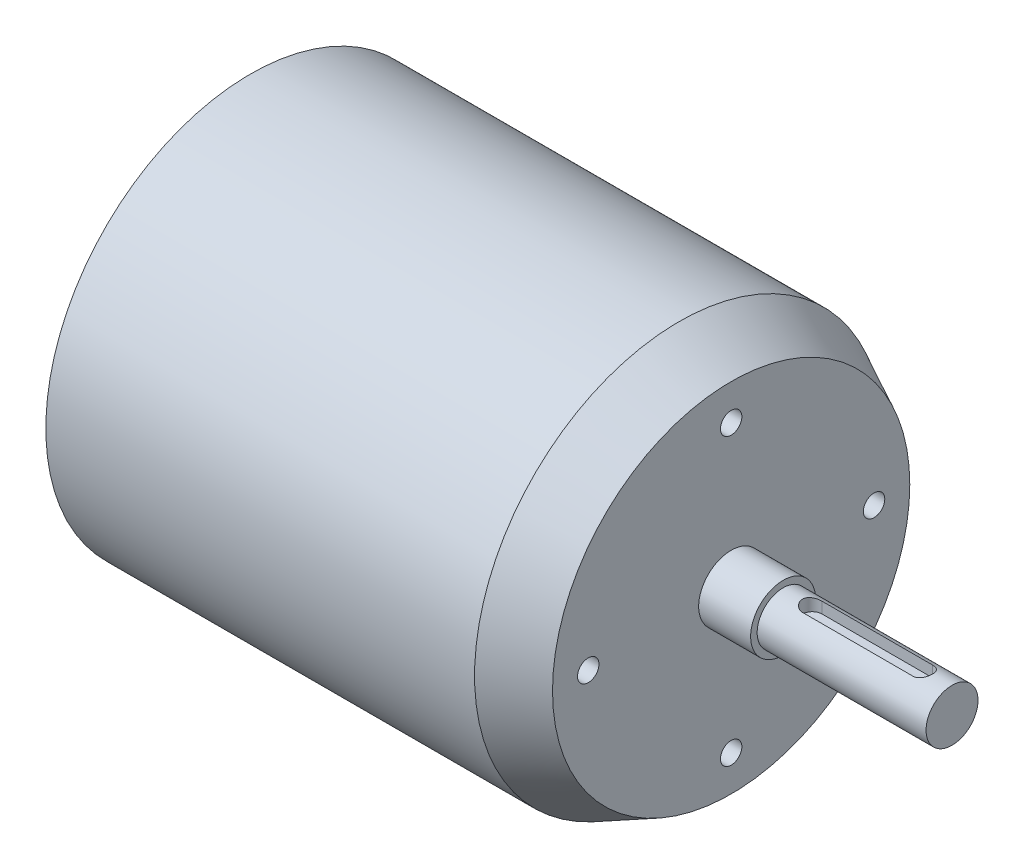
ISO-10303-21;
HEADER;
FILE_DESCRIPTION(('STEP AP214'),'2;1');
FILE_NAME('part.step','',(''),(''),'','','');
FILE_SCHEMA(('AUTOMOTIVE_DESIGN { 1 0 10303 214 1 1 1 1 }'));
ENDSEC;
DATA;
#1=APPLICATION_CONTEXT('core data for automotive mechanical design processes');
#2=APPLICATION_PROTOCOL_DEFINITION('international standard','automotive_design',2000,#1);
#3=PRODUCT_CONTEXT('',#1,'mechanical');
#4=PRODUCT('Part','Part','',(#3));
#5=PRODUCT_RELATED_PRODUCT_CATEGORY('part','',(#4));
#6=PRODUCT_DEFINITION_FORMATION('','',#4);
#7=PRODUCT_DEFINITION_CONTEXT('part definition',#1,'design');
#8=PRODUCT_DEFINITION('design','',#6,#7);
#9=PRODUCT_DEFINITION_SHAPE('','',#8);
#10=(LENGTH_UNIT() NAMED_UNIT(*) SI_UNIT(.MILLI.,.METRE.));
#11=(NAMED_UNIT(*) PLANE_ANGLE_UNIT() SI_UNIT($,.RADIAN.));
#12=(NAMED_UNIT(*) SI_UNIT($,.STERADIAN.) SOLID_ANGLE_UNIT());
#13=UNCERTAINTY_MEASURE_WITH_UNIT(LENGTH_MEASURE(1.E-05),#10,'distance_accuracy_value','');
#14=(GEOMETRIC_REPRESENTATION_CONTEXT(3) GLOBAL_UNCERTAINTY_ASSIGNED_CONTEXT((#13)) GLOBAL_UNIT_ASSIGNED_CONTEXT((#10,
#11,#12)) REPRESENTATION_CONTEXT('',''));
#15=CARTESIAN_POINT('',(0.,0.,0.));
#16=DIRECTION('',(0.,0.,1.));
#17=DIRECTION('',(1.,0.,0.));
#18=AXIS2_PLACEMENT_3D('',#15,#16,#17);
#19=CARTESIAN_POINT('',(0.,0.,0.));
#20=DIRECTION('',(1.,0.,0.));
#21=DIRECTION('',(0.,0.,-1.));
#22=AXIS2_PLACEMENT_3D('',#19,#20,#21);
#23=PLANE('',#22);
#24=CARTESIAN_POINT('',(0.,0.,0.));
#25=DIRECTION('',(1.,0.,0.));
#26=DIRECTION('',(0.,0.,-1.));
#27=AXIS2_PLACEMENT_3D('',#24,#25,#26);
#28=CIRCLE('',#27,5.);
#29=CARTESIAN_POINT('',(0.,0.,-5.));
#30=VERTEX_POINT('',#29);
#31=EDGE_CURVE('E243',#30,#30,#28,.T.);
#32=ORIENTED_EDGE('',*,*,#31,.F.);
#33=EDGE_LOOP('',(#32));
#34=FACE_BOUND('',#33,.T.);
#35=CARTESIAN_POINT('',(0.,0.,22.));
#36=DIRECTION('',(1.,0.,0.));
#37=DIRECTION('',(0.,0.,-1.));
#38=AXIS2_PLACEMENT_3D('',#35,#36,#37);
#39=CIRCLE('',#38,1.65);
#40=CARTESIAN_POINT('',(0.,0.,20.35));
#41=VERTEX_POINT('',#40);
#42=EDGE_CURVE('E153',#41,#41,#39,.T.);
#43=ORIENTED_EDGE('',*,*,#42,.F.);
#44=EDGE_LOOP('',(#43));
#45=FACE_BOUND('',#44,.T.);
#46=CARTESIAN_POINT('',(0.,-22.,0.));
#47=DIRECTION('',(1.,0.,0.));
#48=DIRECTION('',(0.,0.,-1.));
#49=AXIS2_PLACEMENT_3D('',#46,#47,#48);
#50=CIRCLE('',#49,1.65);
#51=CARTESIAN_POINT('',(0.,-22.,-1.65));
#52=VERTEX_POINT('',#51);
#53=EDGE_CURVE('E147',#52,#52,#50,.T.);
#54=ORIENTED_EDGE('',*,*,#53,.F.);
#55=EDGE_LOOP('',(#54));
#56=FACE_BOUND('',#55,.T.);
#57=CARTESIAN_POINT('',(0.,0.,-22.));
#58=DIRECTION('',(1.,0.,0.));
#59=DIRECTION('',(0.,0.,-1.));
#60=AXIS2_PLACEMENT_3D('',#57,#58,#59);
#61=CIRCLE('',#60,1.65);
#62=CARTESIAN_POINT('',(0.,0.,-23.65));
#63=VERTEX_POINT('',#62);
#64=EDGE_CURVE('E134',#63,#63,#61,.T.);
#65=ORIENTED_EDGE('',*,*,#64,.F.);
#66=EDGE_LOOP('',(#65));
#67=FACE_BOUND('',#66,.T.);
#68=CARTESIAN_POINT('',(0.,22.,0.));
#69=DIRECTION('',(1.,0.,0.));
#70=DIRECTION('',(0.,0.,-1.));
#71=AXIS2_PLACEMENT_3D('',#68,#69,#70);
#72=CIRCLE('',#71,1.65);
#73=CARTESIAN_POINT('',(0.,22.,-1.65));
#74=VERTEX_POINT('',#73);
#75=EDGE_CURVE('E135',#74,#74,#72,.T.);
#76=ORIENTED_EDGE('',*,*,#75,.F.);
#77=EDGE_LOOP('',(#76));
#78=FACE_BOUND('',#77,.T.);
#79=CARTESIAN_POINT('',(0.,0.,0.));
#80=DIRECTION('',(1.,0.,0.));
#81=DIRECTION('',(0.,0.,-1.));
#82=AXIS2_PLACEMENT_3D('',#79,#80,#81);
#83=CIRCLE('',#82,27.5);
#84=CARTESIAN_POINT('',(0.,0.,-27.5));
#85=VERTEX_POINT('',#84);
#86=EDGE_CURVE('E282',#85,#85,#83,.T.);
#87=ORIENTED_EDGE('',*,*,#86,.T.);
#88=EDGE_LOOP('',(#87));
#89=FACE_BOUND('',#88,.T.);
#90=ADVANCED_FACE('F73',(#34,#45,#56,#67,#78,#89),#23,.T.);
#91=CARTESIAN_POINT('',(34.,0.,0.));
#92=DIRECTION('',(-1.,0.,0.));
#93=DIRECTION('',(0.,0.,1.));
#94=AXIS2_PLACEMENT_3D('',#91,#92,#93);
#95=CYLINDRICAL_SURFACE('',#94,4.);
#96=CARTESIAN_POINT('',(34.,0.,0.));
#97=DIRECTION('',(1.,0.,0.));
#98=DIRECTION('',(0.,0.,-1.));
#99=AXIS2_PLACEMENT_3D('',#96,#97,#98);
#100=CIRCLE('',#99,4.);
#101=CARTESIAN_POINT('',(34.,0.,-4.));
#102=VERTEX_POINT('',#101);
#103=EDGE_CURVE('E204',#102,#102,#100,.T.);
#104=ORIENTED_EDGE('',*,*,#103,.F.);
#105=EDGE_LOOP('',(#104));
#106=FACE_BOUND('',#105,.T.);
#107=CARTESIAN_POINT('',(8.,0.,0.));
#108=DIRECTION('',(1.,0.,0.));
#109=DIRECTION('',(0.,0.,-1.));
#110=AXIS2_PLACEMENT_3D('',#107,#108,#109);
#111=CIRCLE('',#110,4.);
#112=CARTESIAN_POINT('',(8.,0.,-4.));
#113=VERTEX_POINT('',#112);
#114=EDGE_CURVE('E239',#113,#113,#111,.T.);
#115=ORIENTED_EDGE('',*,*,#114,.T.);
#116=EDGE_LOOP('',(#115));
#117=FACE_BOUND('',#116,.T.);
#118=DIRECTION('',(-1.,0.,0.));
#119=VECTOR('',#118,1.);
#120=CARTESIAN_POINT('',(34.,3.70809924354783,-1.5));
#121=LINE('',#120,#119);
#122=CARTESIAN_POINT('',(29.5,3.70809924354783,-1.5));
#123=VERTEX_POINT('',#122);
#124=CARTESIAN_POINT('',(12.5,3.70809924354783,-1.5));
#125=VERTEX_POINT('',#124);
#126=EDGE_CURVE('E12',#123,#125,#121,.T.);
#127=ORIENTED_EDGE('',*,*,#126,.F.);
#128=CARTESIAN_POINT('',(29.5,3.70809924354783,1.5));
#129=CARTESIAN_POINT('',(29.5405925330296,3.70809443619348,1.50000149729857));
#130=CARTESIAN_POINT('',(29.5811639292878,3.70876663375751,1.49835118206537));
#131=CARTESIAN_POINT('',(29.6619845387273,3.71141673218275,1.49177905295192));
#132=CARTESIAN_POINT('',(29.7022338554932,3.7133941946446,1.48685833749724));
#133=CARTESIAN_POINT('',(29.8217672157252,3.72118975606221,1.46729482367935));
#134=CARTESIAN_POINT('',(29.9001996602272,3.72887188404209,1.44784998767984));
#135=CARTESIAN_POINT('',(30.0523675185151,3.74825217997878,1.39690233043372));
#136=CARTESIAN_POINT('',(30.1261068290407,3.7599469632381,1.36540966903062));
#137=CARTESIAN_POINT('',(30.2673335200613,3.7860238820009,1.29134097725474));
#138=CARTESIAN_POINT('',(30.3348157220124,3.80040821426565,1.24875587557702));
#139=CARTESIAN_POINT('',(30.4648919199407,3.83103589828726,1.15146603872017));
#140=CARTESIAN_POINT('',(30.5271300143182,3.84733374054252,1.09630269892844));
#141=CARTESIAN_POINT('',(30.6417235930174,3.8794978206844,0.976394584974257));
#142=CARTESIAN_POINT('',(30.6940771643404,3.8953639745168,0.911647960429702));
#143=CARTESIAN_POINT('',(30.7891402142536,3.92552893891845,0.771693719740036));
#144=CARTESIAN_POINT('',(30.8314606006837,3.93975598379754,0.696204968758629));
#145=CARTESIAN_POINT('',(30.9026519110829,3.96438035322528,0.538553622304926));
#146=CARTESIAN_POINT('',(30.9315278494869,3.97477910532575,0.456393528521807));
#147=CARTESIAN_POINT('',(30.9737577188216,3.99018690464435,0.29149005067059));
#148=CARTESIAN_POINT('',(30.987727384304,3.99540906103972,0.208924649211911));
#149=CARTESIAN_POINT('',(31.001721197932,4.00064014015322,0.0424658385808881));
#150=CARTESIAN_POINT('',(31.0017496368019,4.00065066686691,-0.0414271540462108));
#151=CARTESIAN_POINT('',(30.988218193771,3.99559264174045,-0.203744100069408));
#152=CARTESIAN_POINT('',(30.9753305247926,3.99077535168083,-0.282233282883083));
#153=CARTESIAN_POINT('',(30.9374637288878,3.97693262269583,-0.435840275995114));
#154=CARTESIAN_POINT('',(30.9124839153537,3.96790694481372,-0.51095789458693));
#155=CARTESIAN_POINT('',(30.8508296074042,3.94637770601049,-0.656988917196577));
#156=CARTESIAN_POINT('',(30.8139901590766,3.93382542785069,-0.72782519801218));
#157=CARTESIAN_POINT('',(30.7298079624269,3.90651314175191,-0.862486444375066));
#158=CARTESIAN_POINT('',(30.6824617982127,3.89175241632298,-0.926309119580089));
#159=CARTESIAN_POINT('',(30.5753768685089,3.86052643048223,-1.04908600084313));
#160=CARTESIAN_POINT('',(30.515075615665,3.84401196825707,-1.10753779261244));
#161=CARTESIAN_POINT('',(30.3854158656222,3.81182684214318,-1.21369725159035));
#162=CARTESIAN_POINT('',(30.3160538253526,3.79615651174147,-1.26140069584828));
#163=CARTESIAN_POINT('',(30.1682419715862,3.7671186794103,-1.34567998313248));
#164=CARTESIAN_POINT('',(30.0896215943324,3.75381153298453,-1.38197861969246));
#165=CARTESIAN_POINT('',(29.9267936781581,3.73171449181344,-1.44059114536973));
#166=CARTESIAN_POINT('',(29.8425957950671,3.72291700934124,-1.46292853893353));
#167=CARTESIAN_POINT('',(29.7146189823522,3.7140622685257,-1.48519272209728));
#168=CARTESIAN_POINT('',(29.6718976704794,3.71183476402566,-1.49074028414002));
#169=CARTESIAN_POINT('',(29.5861259311283,3.70885093143242,-1.49814308997677));
#170=CARTESIAN_POINT('',(29.5430758469706,3.70809323601798,-1.50000176547338));
#171=CARTESIAN_POINT('',(29.5,3.70809924354783,-1.5));
#172=B_SPLINE_CURVE_WITH_KNOTS('',3,(#128,#129,#130,#131,#132,#133,#134,#135,#136,#137,#138,
#139,#140,#141,#142,#143,#144,#145,#146,#147,#148,#149,#150,#151,#152,#153,#154,#155,#156,#157,
#158,#159,#160,#161,#162,#163,#164,#165,#166,#167,#168,#169,#170,#171),.UNSPECIFIED.,.F.,.F.,(4,
2,2,2,2,2,2,2,2,2,2,2,2,2,2,2,2,2,2,2,2,4),(0.,0.121697465666185,0.243354077586413,
0.485593064591345,0.727628221922016,0.969861938431285,1.22298027419407,1.47614754705134,
1.73793539440997,1.9996255232324,2.25002925199203,2.50035591335681,2.73829765644058,
2.97625291175452,3.21767225141683,3.45917019544674,3.71477993951631,3.97048993642583,
4.23200510445915,4.49307880432491,4.62233004062784,4.75146098044214),.UNSPECIFIED.);
#173=CARTESIAN_POINT('',(29.5,3.70809924354783,1.5));
#174=VERTEX_POINT('',#173);
#175=EDGE_CURVE('E81',#174,#123,#172,.T.);
#176=ORIENTED_EDGE('',*,*,#175,.F.);
#177=DIRECTION('',(-1.,0.,0.));
#178=VECTOR('',#177,1.);
#179=CARTESIAN_POINT('',(34.,3.70809924354783,1.5));
#180=LINE('',#179,#178);
#181=CARTESIAN_POINT('',(12.5,3.70809924354783,1.5));
#182=VERTEX_POINT('',#181);
#183=EDGE_CURVE('E95',#182,#174,#180,.F.);
#184=ORIENTED_EDGE('',*,*,#183,.F.);
#185=CARTESIAN_POINT('',(12.5,3.70809924354783,-1.5));
#186=CARTESIAN_POINT('',(12.4594074669704,3.70809443619348,-1.50000149729856));
#187=CARTESIAN_POINT('',(12.4188360707122,3.70876663375751,-1.49835118206537));
#188=CARTESIAN_POINT('',(12.3380154612727,3.71141673218275,-1.49177905295192));
#189=CARTESIAN_POINT('',(12.2977661445068,3.7133941946446,-1.48685833749724));
#190=CARTESIAN_POINT('',(12.1782327842748,3.72118975606221,-1.46729482367934));
#191=CARTESIAN_POINT('',(12.0998003397728,3.7288718840421,-1.44784998767984));
#192=CARTESIAN_POINT('',(11.9476324814849,3.74825217997878,-1.39690233043372));
#193=CARTESIAN_POINT('',(11.8738931709593,3.75994696323811,-1.36540966903062));
#194=CARTESIAN_POINT('',(11.7326664799387,3.78602388200091,-1.29134097725473));
#195=CARTESIAN_POINT('',(11.6651842779876,3.80040821426565,-1.24875587557702));
#196=CARTESIAN_POINT('',(11.5351080800593,3.83103589828726,-1.15146603872016));
#197=CARTESIAN_POINT('',(11.4728699856818,3.84733374054252,-1.09630269892843));
#198=CARTESIAN_POINT('',(11.3582764069826,3.8794978206844,-0.976394584974255));
#199=CARTESIAN_POINT('',(11.3059228356596,3.8953639745168,-0.9116479604297));
#200=CARTESIAN_POINT('',(11.2108597857464,3.92552893891845,-0.771693719740035));
#201=CARTESIAN_POINT('',(11.1685393993163,3.93975598379754,-0.696204968758628));
#202=CARTESIAN_POINT('',(11.0973480889171,3.96438035322528,-0.538553622304924));
#203=CARTESIAN_POINT('',(11.0684721505131,3.97477910532575,-0.456393528521805));
#204=CARTESIAN_POINT('',(11.0262422811784,3.99018690464435,-0.291490050670587));
#205=CARTESIAN_POINT('',(11.012272615696,3.99540906103972,-0.208924649211909));
#206=CARTESIAN_POINT('',(10.998278802068,4.00064014015322,-0.042465838580887));
#207=CARTESIAN_POINT('',(10.9982503631981,4.00065066686691,0.0414271540462113));
#208=CARTESIAN_POINT('',(11.011781806229,3.99559264174045,0.203744100069408));
#209=CARTESIAN_POINT('',(11.0246694752074,3.99077535168083,0.282233282883083));
#210=CARTESIAN_POINT('',(11.0625362711122,3.97693262269583,0.435840275995115));
#211=CARTESIAN_POINT('',(11.0875160846463,3.96790694481372,0.51095789458693));
#212=CARTESIAN_POINT('',(11.1491703925958,3.94637770601049,0.656988917196577));
#213=CARTESIAN_POINT('',(11.1860098409234,3.93382542785069,0.727825198012179));
#214=CARTESIAN_POINT('',(11.2701920375731,3.90651314175191,0.862486444375065));
#215=CARTESIAN_POINT('',(11.3175382017873,3.89175241632298,0.926309119580088));
#216=CARTESIAN_POINT('',(11.4246231314911,3.86052643048223,1.04908600084313));
#217=CARTESIAN_POINT('',(11.484924384335,3.84401196825707,1.10753779261244));
#218=CARTESIAN_POINT('',(11.6145841343778,3.81182684214318,1.21369725159035));
#219=CARTESIAN_POINT('',(11.6839461746474,3.79615651174147,1.26140069584828));
#220=CARTESIAN_POINT('',(11.8317580284138,3.7671186794103,1.34567998313248));
#221=CARTESIAN_POINT('',(11.9103784056676,3.75381153298453,1.38197861969245));
#222=CARTESIAN_POINT('',(12.0732063218419,3.73171449181344,1.44059114536973));
#223=CARTESIAN_POINT('',(12.157404204933,3.72291700934124,1.46292853893353));
#224=CARTESIAN_POINT('',(12.2853810176478,3.7140622685257,1.48519272209728));
#225=CARTESIAN_POINT('',(12.3281023295206,3.71183476402566,1.49074028414002));
#226=CARTESIAN_POINT('',(12.4138740688717,3.70885093143242,1.49814308997677));
#227=CARTESIAN_POINT('',(12.4569241530294,3.70809323601798,1.50000176547338));
#228=CARTESIAN_POINT('',(12.5,3.70809924354783,1.5));
#229=B_SPLINE_CURVE_WITH_KNOTS('',3,(#185,#186,#187,#188,#189,#190,#191,#192,#193,#194,#195,
#196,#197,#198,#199,#200,#201,#202,#203,#204,#205,#206,#207,#208,#209,#210,#211,#212,#213,#214,
#215,#216,#217,#218,#219,#220,#221,#222,#223,#224,#225,#226,#227,#228),.UNSPECIFIED.,.F.,.F.,(4,
2,2,2,2,2,2,2,2,2,2,2,2,2,2,2,2,2,2,2,2,4),(0.,0.121697465666189,0.243354077586421,
0.485593064591345,0.727628221922012,0.969861938431283,1.22298027419406,1.47614754705134,
1.73793539440997,1.99962552323239,2.25002925199202,2.5003559133568,2.73829765644058,
2.97625291175452,3.21767225141682,3.45917019544674,3.7147799395163,3.97048993642582,
4.23200510445915,4.4930788043249,4.62233004062784,4.75146098044213),.UNSPECIFIED.);
#230=EDGE_CURVE('E208',#125,#182,#229,.T.);
#231=ORIENTED_EDGE('',*,*,#230,.F.);
#232=EDGE_LOOP('',(#127,#176,#184,#231));
#233=FACE_BOUND('',#232,.T.);
#234=ADVANCED_FACE('F212',(#106,#117,#233),#95,.T.);
#235=CARTESIAN_POINT('',(8.,0.,0.));
#236=DIRECTION('',(-1.,0.,0.));
#237=DIRECTION('',(0.,0.,1.));
#238=AXIS2_PLACEMENT_3D('',#235,#236,#237);
#239=CYLINDRICAL_SURFACE('',#238,5.);
#240=CARTESIAN_POINT('',(8.,0.,0.));
#241=DIRECTION('',(1.,0.,0.));
#242=DIRECTION('',(0.,0.,-1.));
#243=AXIS2_PLACEMENT_3D('',#240,#241,#242);
#244=CIRCLE('',#243,5.);
#245=CARTESIAN_POINT('',(8.,0.,-5.));
#246=VERTEX_POINT('',#245);
#247=EDGE_CURVE('E244',#246,#246,#244,.T.);
#248=ORIENTED_EDGE('',*,*,#247,.F.);
#249=EDGE_LOOP('',(#248));
#250=FACE_BOUND('',#249,.T.);
#251=ORIENTED_EDGE('',*,*,#31,.T.);
#252=EDGE_LOOP('',(#251));
#253=FACE_BOUND('',#252,.T.);
#254=ADVANCED_FACE('F257',(#250,#253),#239,.T.);
#255=CARTESIAN_POINT('',(8.,0.,0.));
#256=DIRECTION('',(1.,0.,0.));
#257=DIRECTION('',(0.,0.,-1.));
#258=AXIS2_PLACEMENT_3D('',#255,#256,#257);
#259=PLANE('',#258);
#260=ORIENTED_EDGE('',*,*,#114,.F.);
#261=EDGE_LOOP('',(#260));
#262=FACE_BOUND('',#261,.T.);
#263=ORIENTED_EDGE('',*,*,#247,.T.);
#264=EDGE_LOOP('',(#263));
#265=FACE_BOUND('',#264,.T.);
#266=ADVANCED_FACE('F260',(#262,#265),#259,.T.);
#267=CARTESIAN_POINT('',(34.,0.,0.));
#268=DIRECTION('',(1.,0.,0.));
#269=DIRECTION('',(0.,0.,-1.));
#270=AXIS2_PLACEMENT_3D('',#267,#268,#269);
#271=PLANE('',#270);
#272=ORIENTED_EDGE('',*,*,#103,.T.);
#273=EDGE_LOOP('',(#272));
#274=FACE_BOUND('',#273,.T.);
#275=ADVANCED_FACE('F253',(#274),#271,.T.);
#276=CARTESIAN_POINT('',(12.5,4.,-1.5));
#277=DIRECTION('',(0.,0.,1.));
#278=DIRECTION('',(1.,0.,0.));
#279=AXIS2_PLACEMENT_3D('',#276,#277,#278);
#280=PLANE('',#279);
#281=ORIENTED_EDGE('',*,*,#126,.T.);
#282=DIRECTION('',(0.,-1.,0.));
#283=VECTOR('',#282,1.);
#284=CARTESIAN_POINT('',(12.5,4.,-1.5));
#285=LINE('',#284,#283);
#286=CARTESIAN_POINT('',(12.5,2.,-1.5));
#287=VERTEX_POINT('',#286);
#288=EDGE_CURVE('E165',#125,#287,#285,.T.);
#289=ORIENTED_EDGE('',*,*,#288,.T.);
#290=DIRECTION('',(-1.,0.,0.));
#291=VECTOR('',#290,1.);
#292=CARTESIAN_POINT('',(12.5,2.,-1.5));
#293=LINE('',#292,#291);
#294=CARTESIAN_POINT('',(29.5,2.,-1.5));
#295=VERTEX_POINT('',#294);
#296=EDGE_CURVE('E159',#295,#287,#293,.T.);
#297=ORIENTED_EDGE('',*,*,#296,.F.);
#298=DIRECTION('',(0.,-1.,0.));
#299=VECTOR('',#298,1.);
#300=CARTESIAN_POINT('',(29.5,4.,-1.5));
#301=LINE('',#300,#299);
#302=EDGE_CURVE('E169',#123,#295,#301,.T.);
#303=ORIENTED_EDGE('',*,*,#302,.F.);
#304=EDGE_LOOP('',(#281,#289,#297,#303));
#305=FACE_BOUND('',#304,.T.);
#306=ADVANCED_FACE('F196',(#305),#280,.T.);
#307=CARTESIAN_POINT('',(29.5,4.,0.));
#308=DIRECTION('',(0.,-1.,0.));
#309=DIRECTION('',(0.,0.,-1.));
#310=AXIS2_PLACEMENT_3D('',#307,#308,#309);
#311=CYLINDRICAL_SURFACE('',#310,1.5);
#312=ORIENTED_EDGE('',*,*,#175,.T.);
#313=ORIENTED_EDGE('',*,*,#302,.T.);
#314=CARTESIAN_POINT('',(29.5,2.,0.));
#315=DIRECTION('',(0.,1.,0.));
#316=DIRECTION('',(0.,0.,1.));
#317=AXIS2_PLACEMENT_3D('',#314,#315,#316);
#318=CIRCLE('',#317,1.5);
#319=CARTESIAN_POINT('',(29.5,2.,1.5));
#320=VERTEX_POINT('',#319);
#321=EDGE_CURVE('E168',#320,#295,#318,.T.);
#322=ORIENTED_EDGE('',*,*,#321,.F.);
#323=DIRECTION('',(0.,-1.,0.));
#324=VECTOR('',#323,1.);
#325=CARTESIAN_POINT('',(29.5,4.,1.5));
#326=LINE('',#325,#324);
#327=EDGE_CURVE('E172',#174,#320,#326,.T.);
#328=ORIENTED_EDGE('',*,*,#327,.F.);
#329=EDGE_LOOP('',(#312,#313,#322,#328));
#330=FACE_BOUND('',#329,.T.);
#331=ADVANCED_FACE('F210',(#330),#311,.F.);
#332=CARTESIAN_POINT('',(12.5,4.,1.5));
#333=DIRECTION('',(0.,0.,-1.));
#334=DIRECTION('',(-1.,0.,0.));
#335=AXIS2_PLACEMENT_3D('',#332,#333,#334);
#336=PLANE('',#335);
#337=ORIENTED_EDGE('',*,*,#183,.T.);
#338=ORIENTED_EDGE('',*,*,#327,.T.);
#339=DIRECTION('',(1.,0.,0.));
#340=VECTOR('',#339,1.);
#341=CARTESIAN_POINT('',(12.5,2.,1.5));
#342=LINE('',#341,#340);
#343=CARTESIAN_POINT('',(12.5,2.,1.5));
#344=VERTEX_POINT('',#343);
#345=EDGE_CURVE('E175',#344,#320,#342,.T.);
#346=ORIENTED_EDGE('',*,*,#345,.F.);
#347=DIRECTION('',(0.,-1.,0.));
#348=VECTOR('',#347,1.);
#349=CARTESIAN_POINT('',(12.5,4.,1.5));
#350=LINE('',#349,#348);
#351=EDGE_CURVE('E170',#182,#344,#350,.T.);
#352=ORIENTED_EDGE('',*,*,#351,.F.);
#353=EDGE_LOOP('',(#337,#338,#346,#352));
#354=FACE_BOUND('',#353,.T.);
#355=ADVANCED_FACE('F209',(#354),#336,.T.);
#356=CARTESIAN_POINT('',(12.5,4.,0.));
#357=DIRECTION('',(0.,-1.,0.));
#358=DIRECTION('',(0.,0.,-1.));
#359=AXIS2_PLACEMENT_3D('',#356,#357,#358);
#360=CYLINDRICAL_SURFACE('',#359,1.5);
#361=ORIENTED_EDGE('',*,*,#288,.F.);
#362=ORIENTED_EDGE('',*,*,#230,.T.);
#363=ORIENTED_EDGE('',*,*,#351,.T.);
#364=CARTESIAN_POINT('',(12.5,2.,0.));
#365=DIRECTION('',(0.,1.,0.));
#366=DIRECTION('',(0.,0.,1.));
#367=AXIS2_PLACEMENT_3D('',#364,#365,#366);
#368=CIRCLE('',#367,1.5);
#369=EDGE_CURVE('E202',#287,#344,#368,.T.);
#370=ORIENTED_EDGE('',*,*,#369,.F.);
#371=EDGE_LOOP('',(#361,#362,#363,#370));
#372=FACE_BOUND('',#371,.T.);
#373=ADVANCED_FACE('F207',(#372),#360,.F.);
#374=CARTESIAN_POINT('',(0.,2.,0.));
#375=DIRECTION('',(0.,-1.,0.));
#376=DIRECTION('',(0.,0.,-1.));
#377=AXIS2_PLACEMENT_3D('',#374,#375,#376);
#378=PLANE('',#377);
#379=ORIENTED_EDGE('',*,*,#369,.T.);
#380=ORIENTED_EDGE('',*,*,#345,.T.);
#381=ORIENTED_EDGE('',*,*,#321,.T.);
#382=ORIENTED_EDGE('',*,*,#296,.T.);
#383=EDGE_LOOP('',(#379,#380,#381,#382));
#384=FACE_BOUND('',#383,.T.);
#385=ADVANCED_FACE('F192',(#384),#378,.F.);
#386=CARTESIAN_POINT('',(-10.1,0.,22.));
#387=DIRECTION('',(1.,0.,0.));
#388=DIRECTION('',(0.,0.,-1.));
#389=AXIS2_PLACEMENT_3D('',#386,#387,#388);
#390=CONICAL_SURFACE('',#389,1.65,1.02974425867665);
#391=CARTESIAN_POINT('',(-11.0914200213955,0.,22.));
#392=VERTEX_POINT('',#391);
#393=VERTEX_LOOP('',#392);
#394=FACE_BOUND('',#393,.T.);
#395=CARTESIAN_POINT('',(-10.1,0.,22.));
#396=DIRECTION('',(1.,0.,0.));
#397=DIRECTION('',(0.,0.,-1.));
#398=AXIS2_PLACEMENT_3D('',#395,#396,#397);
#399=CIRCLE('',#398,1.65);
#400=CARTESIAN_POINT('',(-10.1,0.,20.35));
#401=VERTEX_POINT('',#400);
#402=EDGE_CURVE('E156',#401,#401,#399,.T.);
#403=ORIENTED_EDGE('',*,*,#402,.T.);
#404=EDGE_LOOP('',(#403));
#405=FACE_BOUND('',#404,.T.);
#406=ADVANCED_FACE('F323',(#394,#405),#390,.F.);
#407=CARTESIAN_POINT('',(0.,0.,22.));
#408=DIRECTION('',(1.,0.,0.));
#409=DIRECTION('',(0.,0.,-1.));
#410=AXIS2_PLACEMENT_3D('',#407,#408,#409);
#411=CYLINDRICAL_SURFACE('',#410,1.65);
#412=ORIENTED_EDGE('',*,*,#402,.F.);
#413=EDGE_LOOP('',(#412));
#414=FACE_BOUND('',#413,.T.);
#415=ORIENTED_EDGE('',*,*,#42,.T.);
#416=EDGE_LOOP('',(#415));
#417=FACE_BOUND('',#416,.T.);
#418=ADVANCED_FACE('F320',(#414,#417),#411,.F.);
#419=CARTESIAN_POINT('',(-10.1,-22.,0.));
#420=DIRECTION('',(1.,0.,0.));
#421=DIRECTION('',(0.,0.,-1.));
#422=AXIS2_PLACEMENT_3D('',#419,#420,#421);
#423=CONICAL_SURFACE('',#422,1.65,1.02974425867665);
#424=CARTESIAN_POINT('',(-11.0914200213955,-22.,0.));
#425=VERTEX_POINT('',#424);
#426=VERTEX_LOOP('',#425);
#427=FACE_BOUND('',#426,.T.);
#428=CARTESIAN_POINT('',(-10.1,-22.,0.));
#429=DIRECTION('',(1.,0.,0.));
#430=DIRECTION('',(0.,0.,-1.));
#431=AXIS2_PLACEMENT_3D('',#428,#429,#430);
#432=CIRCLE('',#431,1.65);
#433=CARTESIAN_POINT('',(-10.1,-22.,-1.65));
#434=VERTEX_POINT('',#433);
#435=EDGE_CURVE('E150',#434,#434,#432,.T.);
#436=ORIENTED_EDGE('',*,*,#435,.T.);
#437=EDGE_LOOP('',(#436));
#438=FACE_BOUND('',#437,.T.);
#439=ADVANCED_FACE('F316',(#427,#438),#423,.F.);
#440=CARTESIAN_POINT('',(0.,-22.,0.));
#441=DIRECTION('',(1.,0.,0.));
#442=DIRECTION('',(0.,0.,-1.));
#443=AXIS2_PLACEMENT_3D('',#440,#441,#442);
#444=CYLINDRICAL_SURFACE('',#443,1.65);
#445=ORIENTED_EDGE('',*,*,#435,.F.);
#446=EDGE_LOOP('',(#445));
#447=FACE_BOUND('',#446,.T.);
#448=ORIENTED_EDGE('',*,*,#53,.T.);
#449=EDGE_LOOP('',(#448));
#450=FACE_BOUND('',#449,.T.);
#451=ADVANCED_FACE('F312',(#447,#450),#444,.F.);
#452=CARTESIAN_POINT('',(-10.1,0.,-22.));
#453=DIRECTION('',(1.,0.,0.));
#454=DIRECTION('',(0.,0.,-1.));
#455=AXIS2_PLACEMENT_3D('',#452,#453,#454);
#456=CONICAL_SURFACE('',#455,1.65,1.02974425867665);
#457=CARTESIAN_POINT('',(-11.0914200213955,0.,-22.));
#458=VERTEX_POINT('',#457);
#459=VERTEX_LOOP('',#458);
#460=FACE_BOUND('',#459,.T.);
#461=CARTESIAN_POINT('',(-10.1,0.,-22.));
#462=DIRECTION('',(1.,0.,0.));
#463=DIRECTION('',(0.,0.,-1.));
#464=AXIS2_PLACEMENT_3D('',#461,#462,#463);
#465=CIRCLE('',#464,1.65);
#466=CARTESIAN_POINT('',(-10.1,0.,-23.65));
#467=VERTEX_POINT('',#466);
#468=EDGE_CURVE('E138',#467,#467,#465,.T.);
#469=ORIENTED_EDGE('',*,*,#468,.T.);
#470=EDGE_LOOP('',(#469));
#471=FACE_BOUND('',#470,.T.);
#472=ADVANCED_FACE('F308',(#460,#471),#456,.F.);
#473=CARTESIAN_POINT('',(0.,0.,-22.));
#474=DIRECTION('',(1.,0.,0.));
#475=DIRECTION('',(0.,0.,-1.));
#476=AXIS2_PLACEMENT_3D('',#473,#474,#475);
#477=CYLINDRICAL_SURFACE('',#476,1.65);
#478=ORIENTED_EDGE('',*,*,#468,.F.);
#479=EDGE_LOOP('',(#478));
#480=FACE_BOUND('',#479,.T.);
#481=ORIENTED_EDGE('',*,*,#64,.T.);
#482=EDGE_LOOP('',(#481));
#483=FACE_BOUND('',#482,.T.);
#484=ADVANCED_FACE('F128',(#480,#483),#477,.F.);
#485=CARTESIAN_POINT('',(-10.1,22.,0.));
#486=DIRECTION('',(1.,0.,0.));
#487=DIRECTION('',(0.,0.,-1.));
#488=AXIS2_PLACEMENT_3D('',#485,#486,#487);
#489=CONICAL_SURFACE('',#488,1.65,1.02974425867665);
#490=CARTESIAN_POINT('',(-11.0914200213955,22.,0.));
#491=VERTEX_POINT('',#490);
#492=VERTEX_LOOP('',#491);
#493=FACE_BOUND('',#492,.T.);
#494=CARTESIAN_POINT('',(-10.1,22.,0.));
#495=DIRECTION('',(1.,0.,0.));
#496=DIRECTION('',(0.,0.,-1.));
#497=AXIS2_PLACEMENT_3D('',#494,#495,#496);
#498=CIRCLE('',#497,1.65);
#499=CARTESIAN_POINT('',(-10.1,22.,-1.65));
#500=VERTEX_POINT('',#499);
#501=EDGE_CURVE('E132',#500,#500,#498,.T.);
#502=ORIENTED_EDGE('',*,*,#501,.T.);
#503=EDGE_LOOP('',(#502));
#504=FACE_BOUND('',#503,.T.);
#505=ADVANCED_FACE('F124',(#493,#504),#489,.F.);
#506=CARTESIAN_POINT('',(0.,22.,0.));
#507=DIRECTION('',(1.,0.,0.));
#508=DIRECTION('',(0.,0.,-1.));
#509=AXIS2_PLACEMENT_3D('',#506,#507,#508);
#510=CYLINDRICAL_SURFACE('',#509,1.65);
#511=ORIENTED_EDGE('',*,*,#501,.F.);
#512=EDGE_LOOP('',(#511));
#513=FACE_BOUND('',#512,.T.);
#514=ORIENTED_EDGE('',*,*,#75,.T.);
#515=EDGE_LOOP('',(#514));
#516=FACE_BOUND('',#515,.T.);
#517=ADVANCED_FACE('F127',(#513,#516),#510,.F.);
#518=CARTESIAN_POINT('',(-8.,0.,0.));
#519=DIRECTION('',(-1.,0.,0.));
#520=DIRECTION('',(0.,0.,1.));
#521=AXIS2_PLACEMENT_3D('',#518,#519,#520);
#522=CONICAL_SURFACE('',#521,31.5,0.463647609000806);
#523=ORIENTED_EDGE('',*,*,#86,.F.);
#524=EDGE_LOOP('',(#523));
#525=FACE_BOUND('',#524,.T.);
#526=CARTESIAN_POINT('',(-8.,0.,0.));
#527=DIRECTION('',(1.,0.,0.));
#528=DIRECTION('',(0.,0.,-1.));
#529=AXIS2_PLACEMENT_3D('',#526,#527,#528);
#530=CIRCLE('',#529,31.5);
#531=CARTESIAN_POINT('',(-8.,0.,-31.5));
#532=VERTEX_POINT('',#531);
#533=EDGE_CURVE('E141',#532,#532,#530,.T.);
#534=ORIENTED_EDGE('',*,*,#533,.T.);
#535=EDGE_LOOP('',(#534));
#536=FACE_BOUND('',#535,.T.);
#537=ADVANCED_FACE('F288',(#525,#536),#522,.T.);
#538=CARTESIAN_POINT('',(-74.,0.,0.));
#539=DIRECTION('',(1.,0.,0.));
#540=DIRECTION('',(0.,0.,-1.));
#541=AXIS2_PLACEMENT_3D('',#538,#539,#540);
#542=PLANE('',#541);
#543=CARTESIAN_POINT('',(-74.,0.,0.));
#544=DIRECTION('',(1.,0.,0.));
#545=DIRECTION('',(0.,0.,-1.));
#546=AXIS2_PLACEMENT_3D('',#543,#544,#545);
#547=CIRCLE('',#546,31.5);
#548=CARTESIAN_POINT('',(-74.,0.,-31.5));
#549=VERTEX_POINT('',#548);
#550=EDGE_CURVE('E240',#549,#549,#547,.T.);
#551=ORIENTED_EDGE('',*,*,#550,.F.);
#552=EDGE_LOOP('',(#551));
#553=FACE_BOUND('',#552,.T.);
#554=ADVANCED_FACE('F292',(#553),#542,.F.);
#555=CARTESIAN_POINT('',(-74.,0.,0.));
#556=DIRECTION('',(1.,0.,0.));
#557=DIRECTION('',(0.,0.,-1.));
#558=AXIS2_PLACEMENT_3D('',#555,#556,#557);
#559=CYLINDRICAL_SURFACE('',#558,31.5);
#560=ORIENTED_EDGE('',*,*,#533,.F.);
#561=EDGE_LOOP('',(#560));
#562=FACE_BOUND('',#561,.T.);
#563=ORIENTED_EDGE('',*,*,#550,.T.);
#564=EDGE_LOOP('',(#563));
#565=FACE_BOUND('',#564,.T.);
#566=ADVANCED_FACE('F75',(#562,#565),#559,.T.);
#567=CLOSED_SHELL('',(#90,#234,#254,#266,#275,#306,#331,#355,#373,#385,#406,#418,#439,#451,#472,
#484,#505,#517,#537,#554,#566));
#568=MANIFOLD_SOLID_BREP('B2',#567);
#569=ADVANCED_BREP_SHAPE_REPRESENTATION('',(#18,#568),#14);
#570=SHAPE_DEFINITION_REPRESENTATION(#9,#569);
ENDSEC;
END-ISO-10303-21;
